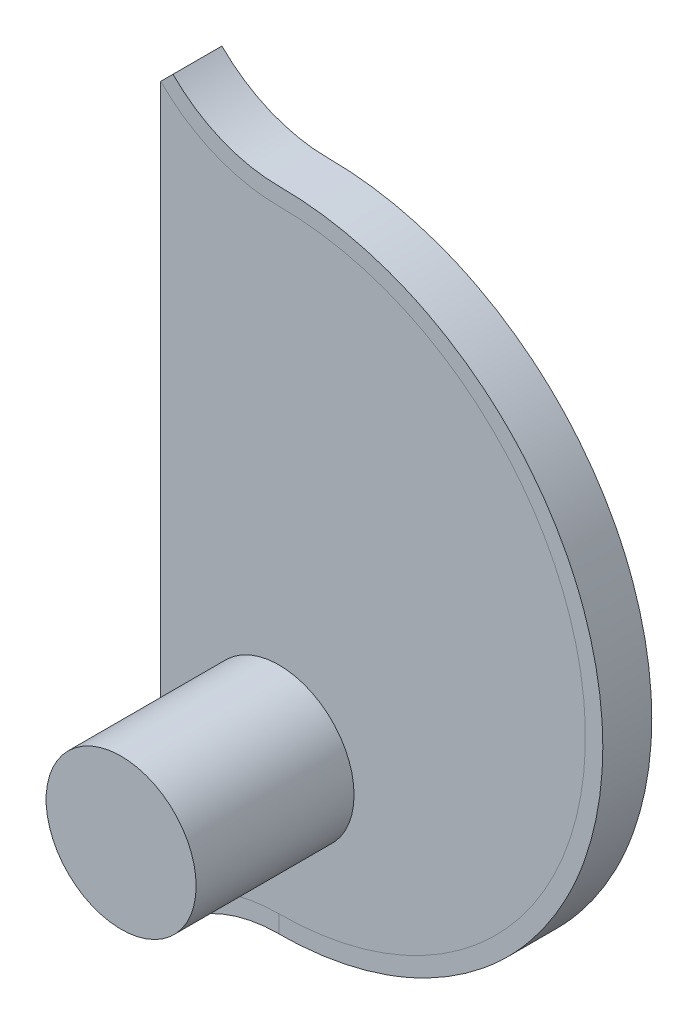
ISO-10303-21;
HEADER;
FILE_DESCRIPTION(('STEP AP214'),'2;1');
FILE_NAME('part.step','',(''),(''),'','','');
FILE_SCHEMA(('AUTOMOTIVE_DESIGN { 1 0 10303 214 1 1 1 1 }'));
ENDSEC;
DATA;
#1=APPLICATION_CONTEXT('core data for automotive mechanical design processes');
#2=APPLICATION_PROTOCOL_DEFINITION('international standard','automotive_design',2000,#1);
#3=PRODUCT_CONTEXT('',#1,'mechanical');
#4=PRODUCT('Part','Part','',(#3));
#5=PRODUCT_RELATED_PRODUCT_CATEGORY('part','',(#4));
#6=PRODUCT_DEFINITION_FORMATION('','',#4);
#7=PRODUCT_DEFINITION_CONTEXT('part definition',#1,'design');
#8=PRODUCT_DEFINITION('design','',#6,#7);
#9=PRODUCT_DEFINITION_SHAPE('','',#8);
#10=(LENGTH_UNIT() NAMED_UNIT(*) SI_UNIT(.MILLI.,.METRE.));
#11=(NAMED_UNIT(*) PLANE_ANGLE_UNIT() SI_UNIT($,.RADIAN.));
#12=(NAMED_UNIT(*) SI_UNIT($,.STERADIAN.) SOLID_ANGLE_UNIT());
#13=UNCERTAINTY_MEASURE_WITH_UNIT(LENGTH_MEASURE(1.E-05),#10,'distance_accuracy_value','');
#14=(GEOMETRIC_REPRESENTATION_CONTEXT(3) GLOBAL_UNCERTAINTY_ASSIGNED_CONTEXT((#13)) GLOBAL_UNIT_ASSIGNED_CONTEXT((#10,
#11,#12)) REPRESENTATION_CONTEXT('',''));
#15=CARTESIAN_POINT('',(0.,0.,0.));
#16=DIRECTION('',(0.,0.,1.));
#17=DIRECTION('',(1.,0.,0.));
#18=AXIS2_PLACEMENT_3D('',#15,#16,#17);
#19=CARTESIAN_POINT('',(-14.9906637611548,0.,-107.965613537095));
#20=DIRECTION('',(-1.,0.,0.));
#21=DIRECTION('',(0.,-1.,0.));
#22=AXIS2_PLACEMENT_3D('',#19,#20,#21);
#23=PLANE('',#22);
#24=DIRECTION('',(0.,1.,0.));
#25=VECTOR('',#24,1.);
#26=CARTESIAN_POINT('',(-14.9906637611548,0.,-3.10000000000001));
#27=LINE('',#26,#25);
#28=CARTESIAN_POINT('',(-14.9906637611548,-86.0093362388452,-3.10000000000001));
#29=VERTEX_POINT('',#28);
#30=CARTESIAN_POINT('',(-14.9906637611548,4.00933623884522,-3.10000000000001));
#31=VERTEX_POINT('',#30);
#32=EDGE_CURVE('E77',#29,#31,#27,.T.);
#33=ORIENTED_EDGE('',*,*,#32,.F.);
#34=DIRECTION('',(0.,0.,1.));
#35=VECTOR('',#34,1.);
#36=CARTESIAN_POINT('',(-14.9906637611548,-86.0093362388452,-107.965613537095));
#37=LINE('',#36,#35);
#38=CARTESIAN_POINT('',(-14.9906637611548,-86.0093362388452,3.1));
#39=VERTEX_POINT('',#38);
#40=EDGE_CURVE('E96',#29,#39,#37,.T.);
#41=ORIENTED_EDGE('',*,*,#40,.T.);
#42=DIRECTION('',(0.,-1.,0.));
#43=VECTOR('',#42,1.);
#44=CARTESIAN_POINT('',(-14.9906637611548,0.,3.1));
#45=LINE('',#44,#43);
#46=CARTESIAN_POINT('',(-14.9906637611548,4.00933623884522,3.1));
#47=VERTEX_POINT('',#46);
#48=EDGE_CURVE('E100',#47,#39,#45,.T.);
#49=ORIENTED_EDGE('',*,*,#48,.F.);
#50=DIRECTION('',(0.,0.,1.));
#51=VECTOR('',#50,1.);
#52=CARTESIAN_POINT('',(-14.9906637611548,4.00933623884522,-107.965613537095));
#53=LINE('',#52,#51);
#54=EDGE_CURVE('E146',#31,#47,#53,.T.);
#55=ORIENTED_EDGE('',*,*,#54,.F.);
#56=EDGE_LOOP('',(#33,#41,#49,#55));
#57=FACE_BOUND('',#56,.T.);
#58=ADVANCED_FACE('F55',(#57),#23,.T.);
#59=CARTESIAN_POINT('',(0.,19.,-107.965613537095));
#60=DIRECTION('',(0.,0.,1.));
#61=DIRECTION('',(1.,0.,0.));
#62=AXIS2_PLACEMENT_3D('',#59,#60,#61);
#63=CYLINDRICAL_SURFACE('',#62,21.2);
#64=DIRECTION('',(0.,0.,1.));
#65=VECTOR('',#64,1.);
#66=CARTESIAN_POINT('',(0.,-2.19999999999999,-107.965613537095));
#67=LINE('',#66,#65);
#68=CARTESIAN_POINT('',(0.,-2.19999999999999,-3.10000000000001));
#69=VERTEX_POINT('',#68);
#70=CARTESIAN_POINT('',(0.,-2.19999999999999,3.1));
#71=VERTEX_POINT('',#70);
#72=EDGE_CURVE('E140',#69,#71,#67,.T.);
#73=ORIENTED_EDGE('',*,*,#72,.F.);
#74=CARTESIAN_POINT('',(0.,19.,-3.10000000000001));
#75=DIRECTION('',(0.,0.,1.));
#76=DIRECTION('',(1.,0.,0.));
#77=AXIS2_PLACEMENT_3D('',#74,#75,#76);
#78=CIRCLE('',#77,21.2);
#79=EDGE_CURVE('E72',#69,#31,#78,.F.);
#80=ORIENTED_EDGE('',*,*,#79,.T.);
#81=ORIENTED_EDGE('',*,*,#54,.T.);
#82=CARTESIAN_POINT('',(0.,19.,3.10000000000001));
#83=DIRECTION('',(0.,0.,1.));
#84=DIRECTION('',(-0.707106781186549,-0.707106781186546,0.));
#85=AXIS2_PLACEMENT_3D('',#82,#83,#84);
#86=CIRCLE('',#85,21.2);
#87=EDGE_CURVE('E105',#47,#71,#86,.T.);
#88=ORIENTED_EDGE('',*,*,#87,.T.);
#89=EDGE_LOOP('',(#73,#80,#81,#88));
#90=FACE_BOUND('',#89,.T.);
#91=ADVANCED_FACE('F157',(#90),#63,.F.);
#92=CARTESIAN_POINT('',(0.,-41.,-107.965613537095));
#93=DIRECTION('',(0.,0.,1.));
#94=DIRECTION('',(1.,0.,0.));
#95=AXIS2_PLACEMENT_3D('',#92,#93,#94);
#96=CYLINDRICAL_SURFACE('',#95,38.8);
#97=DIRECTION('',(0.,0.,1.));
#98=VECTOR('',#97,1.);
#99=CARTESIAN_POINT('',(0.,-79.8,-107.965613537095));
#100=LINE('',#99,#98);
#101=CARTESIAN_POINT('',(0.,-79.8,-3.10000000000001));
#102=VERTEX_POINT('',#101);
#103=CARTESIAN_POINT('',(0.,-79.8,3.1));
#104=VERTEX_POINT('',#103);
#105=EDGE_CURVE('E104',#102,#104,#100,.T.);
#106=ORIENTED_EDGE('',*,*,#105,.F.);
#107=CARTESIAN_POINT('',(0.,-41.,-3.10000000000001));
#108=DIRECTION('',(0.,0.,1.));
#109=DIRECTION('',(1.,0.,0.));
#110=AXIS2_PLACEMENT_3D('',#107,#108,#109);
#111=CIRCLE('',#110,38.8);
#112=EDGE_CURVE('E192',#102,#69,#111,.T.);
#113=ORIENTED_EDGE('',*,*,#112,.T.);
#114=ORIENTED_EDGE('',*,*,#72,.T.);
#115=CARTESIAN_POINT('',(0.,-41.,3.10000000000001));
#116=DIRECTION('',(0.,0.,-1.));
#117=DIRECTION('',(0.,1.,0.));
#118=AXIS2_PLACEMENT_3D('',#115,#116,#117);
#119=CIRCLE('',#118,38.8);
#120=EDGE_CURVE('E115',#71,#104,#119,.T.);
#121=ORIENTED_EDGE('',*,*,#120,.T.);
#122=EDGE_LOOP('',(#106,#113,#114,#121));
#123=FACE_BOUND('',#122,.T.);
#124=ADVANCED_FACE('F166',(#123),#96,.T.);
#125=CARTESIAN_POINT('',(0.,-101.,-107.965613537095));
#126=DIRECTION('',(0.,0.,1.));
#127=DIRECTION('',(1.,0.,0.));
#128=AXIS2_PLACEMENT_3D('',#125,#126,#127);
#129=CYLINDRICAL_SURFACE('',#128,21.2);
#130=CARTESIAN_POINT('',(0.,-101.,-3.10000000000001));
#131=DIRECTION('',(0.,0.,1.));
#132=DIRECTION('',(1.,0.,0.));
#133=AXIS2_PLACEMENT_3D('',#130,#131,#132);
#134=CIRCLE('',#133,21.2);
#135=EDGE_CURVE('E64',#102,#29,#134,.T.);
#136=ORIENTED_EDGE('',*,*,#135,.F.);
#137=ORIENTED_EDGE('',*,*,#105,.T.);
#138=CARTESIAN_POINT('',(0.,-101.,3.1));
#139=DIRECTION('',(0.,0.,1.));
#140=DIRECTION('',(1.,0.,0.));
#141=AXIS2_PLACEMENT_3D('',#138,#139,#140);
#142=CIRCLE('',#141,21.2);
#143=EDGE_CURVE('E108',#39,#104,#142,.F.);
#144=ORIENTED_EDGE('',*,*,#143,.F.);
#145=ORIENTED_EDGE('',*,*,#40,.F.);
#146=EDGE_LOOP('',(#136,#137,#144,#145));
#147=FACE_BOUND('',#146,.T.);
#148=ADVANCED_FACE('F109',(#147),#129,.F.);
#149=CARTESIAN_POINT('',(0.,0.,3.1));
#150=DIRECTION('',(0.,0.,1.));
#151=DIRECTION('',(1.,0.,0.));
#152=AXIS2_PLACEMENT_3D('',#149,#150,#151);
#153=PLANE('',#152);
#154=CARTESIAN_POINT('',(0.,-62.,3.1));
#155=DIRECTION('',(0.,0.,1.));
#156=DIRECTION('',(1.,0.,0.));
#157=AXIS2_PLACEMENT_3D('',#154,#155,#156);
#158=CIRCLE('',#157,9.49999999999999);
#159=CARTESIAN_POINT('',(9.49999999999999,-62.,3.1));
#160=VERTEX_POINT('',#159);
#161=EDGE_CURVE('E12',#160,#160,#158,.T.);
#162=ORIENTED_EDGE('',*,*,#161,.F.);
#163=EDGE_LOOP('',(#162));
#164=FACE_BOUND('',#163,.T.);
#165=ORIENTED_EDGE('',*,*,#48,.T.);
#166=ORIENTED_EDGE('',*,*,#143,.T.);
#167=ORIENTED_EDGE('',*,*,#120,.F.);
#168=ORIENTED_EDGE('',*,*,#87,.F.);
#169=EDGE_LOOP('',(#165,#166,#167,#168));
#170=FACE_BOUND('',#169,.T.);
#171=ADVANCED_FACE('F118',(#164,#170),#153,.T.);
#172=CARTESIAN_POINT('',(0.,-79.8,-3.1));
#173=DIRECTION('',(0.,0.,1.));
#174=DIRECTION('',(1.,0.,0.));
#175=AXIS2_PLACEMENT_3D('',#172,#173,#174);
#176=PLANE('',#175);
#177=CARTESIAN_POINT('',(0.,-62.,-3.1));
#178=DIRECTION('',(0.,0.,1.));
#179=DIRECTION('',(1.,0.,0.));
#180=AXIS2_PLACEMENT_3D('',#177,#178,#179);
#181=CIRCLE('',#180,9.49999999999999);
#182=CARTESIAN_POINT('',(9.49999999999999,-62.,-3.1));
#183=VERTEX_POINT('',#182);
#184=EDGE_CURVE('E58',#183,#183,#181,.T.);
#185=ORIENTED_EDGE('',*,*,#184,.T.);
#186=EDGE_LOOP('',(#185));
#187=FACE_BOUND('',#186,.T.);
#188=ORIENTED_EDGE('',*,*,#32,.T.);
#189=ORIENTED_EDGE('',*,*,#79,.F.);
#190=ORIENTED_EDGE('',*,*,#112,.F.);
#191=ORIENTED_EDGE('',*,*,#135,.T.);
#192=EDGE_LOOP('',(#188,#189,#190,#191));
#193=FACE_BOUND('',#192,.T.);
#194=ADVANCED_FACE('F244',(#187,#193),#176,.F.);
#195=CARTESIAN_POINT('',(0.,-62.,-26.7));
#196=DIRECTION('',(0.,0.,1.));
#197=DIRECTION('',(1.,0.,0.));
#198=AXIS2_PLACEMENT_3D('',#195,#196,#197);
#199=PLANE('',#198);
#200=CARTESIAN_POINT('',(0.,-62.,-26.7));
#201=DIRECTION('',(0.,0.,1.));
#202=DIRECTION('',(1.,0.,0.));
#203=AXIS2_PLACEMENT_3D('',#200,#201,#202);
#204=CIRCLE('',#203,9.49999999999999);
#205=CARTESIAN_POINT('',(9.49999999999999,-62.,-26.7));
#206=VERTEX_POINT('',#205);
#207=EDGE_CURVE('E125',#206,#206,#204,.T.);
#208=ORIENTED_EDGE('',*,*,#207,.F.);
#209=EDGE_LOOP('',(#208));
#210=FACE_BOUND('',#209,.T.);
#211=ADVANCED_FACE('F219',(#210),#199,.F.);
#212=CARTESIAN_POINT('',(0.,-62.,-26.7));
#213=DIRECTION('',(0.,0.,1.));
#214=DIRECTION('',(1.,0.,0.));
#215=AXIS2_PLACEMENT_3D('',#212,#213,#214);
#216=CYLINDRICAL_SURFACE('',#215,9.49999999999999);
#217=ORIENTED_EDGE('',*,*,#207,.T.);
#218=EDGE_LOOP('',(#217));
#219=FACE_BOUND('',#218,.T.);
#220=ORIENTED_EDGE('',*,*,#184,.F.);
#221=EDGE_LOOP('',(#220));
#222=FACE_BOUND('',#221,.T.);
#223=ADVANCED_FACE('F211',(#219,#222),#216,.T.);
#224=ORIENTED_EDGE('',*,*,#161,.T.);
#225=EDGE_LOOP('',(#224));
#226=FACE_BOUND('',#225,.T.);
#227=CARTESIAN_POINT('',(0.,-62.,23.1));
#228=DIRECTION('',(0.,0.,1.));
#229=DIRECTION('',(1.,0.,0.));
#230=AXIS2_PLACEMENT_3D('',#227,#228,#229);
#231=CIRCLE('',#230,9.49999999999999);
#232=CARTESIAN_POINT('',(9.49999999999999,-62.,23.1));
#233=VERTEX_POINT('',#232);
#234=EDGE_CURVE('E202',#233,#233,#231,.T.);
#235=ORIENTED_EDGE('',*,*,#234,.F.);
#236=EDGE_LOOP('',(#235));
#237=FACE_BOUND('',#236,.T.);
#238=ADVANCED_FACE('F209',(#226,#237),#216,.T.);
#239=CARTESIAN_POINT('',(0.,-62.,23.1));
#240=DIRECTION('',(0.,0.,1.));
#241=DIRECTION('',(1.,0.,0.));
#242=AXIS2_PLACEMENT_3D('',#239,#240,#241);
#243=PLANE('',#242);
#244=ORIENTED_EDGE('',*,*,#234,.T.);
#245=EDGE_LOOP('',(#244));
#246=FACE_BOUND('',#245,.T.);
#247=ADVANCED_FACE('F207',(#246),#243,.T.);
#248=CLOSED_SHELL('',(#58,#91,#124,#148,#171,#194,#211,#223,#238,#247));
#249=MANIFOLD_SOLID_BREP('B2',#248);
#250=CARTESIAN_POINT('',(-13.4350288425444,-87.5649711574556,0.));
#251=DIRECTION('',(0.707106781186546,0.707106781186549,0.));
#252=DIRECTION('',(0.,0.,1.));
#253=AXIS2_PLACEMENT_3D('',#250,#251,#252);
#254=PLANE('',#253);
#255=DIRECTION('',(0.707106781186549,-0.707106781186546,0.));
#256=VECTOR('',#255,1.);
#257=CARTESIAN_POINT('',(-14.9906637611548,-86.0093362388452,-3.1));
#258=LINE('',#257,#256);
#259=CARTESIAN_POINT('',(-14.9906637611548,-86.0093362388452,-3.1));
#260=VERTEX_POINT('',#259);
#261=CARTESIAN_POINT('',(-13.4350288425444,-87.5649711574556,-3.1));
#262=VERTEX_POINT('',#261);
#263=EDGE_CURVE('E422',#260,#262,#258,.T.);
#264=ORIENTED_EDGE('',*,*,#263,.T.);
#265=DIRECTION('',(0.,0.,1.));
#266=VECTOR('',#265,1.);
#267=CARTESIAN_POINT('',(-13.4350288425444,-87.5649711574556,3.1));
#268=LINE('',#267,#266);
#269=CARTESIAN_POINT('',(-13.4350288425444,-87.5649711574556,3.1));
#270=VERTEX_POINT('',#269);
#271=EDGE_CURVE('E429',#262,#270,#268,.T.);
#272=ORIENTED_EDGE('',*,*,#271,.T.);
#273=DIRECTION('',(-0.707106781186549,0.707106781186546,0.));
#274=VECTOR('',#273,1.);
#275=CARTESIAN_POINT('',(-13.4350288425444,-87.5649711574556,3.1));
#276=LINE('',#275,#274);
#277=CARTESIAN_POINT('',(-14.9906637611548,-86.0093362388452,3.1));
#278=VERTEX_POINT('',#277);
#279=EDGE_CURVE('E411',#270,#278,#276,.T.);
#280=ORIENTED_EDGE('',*,*,#279,.T.);
#281=DIRECTION('',(0.,0.,-1.));
#282=VECTOR('',#281,1.);
#283=CARTESIAN_POINT('',(-14.9906637611548,-86.0093362388452,3.1));
#284=LINE('',#283,#282);
#285=EDGE_CURVE('E404',#278,#260,#284,.T.);
#286=ORIENTED_EDGE('',*,*,#285,.T.);
#287=EDGE_LOOP('',(#264,#272,#280,#286));
#288=FACE_BOUND('',#287,.T.);
#289=ADVANCED_FACE('F328',(#288),#254,.F.);
#290=CARTESIAN_POINT('',(-13.4350288425444,5.56497115745562,0.));
#291=DIRECTION('',(-0.707106781186547,0.707106781186549,0.));
#292=DIRECTION('',(0.,0.,1.));
#293=AXIS2_PLACEMENT_3D('',#290,#291,#292);
#294=PLANE('',#293);
#295=DIRECTION('',(0.707106781186549,0.707106781186546,0.));
#296=VECTOR('',#295,1.);
#297=CARTESIAN_POINT('',(-14.9906637611548,4.00933623884522,-3.1));
#298=LINE('',#297,#296);
#299=CARTESIAN_POINT('',(-14.9906637611548,4.00933623884522,-3.1));
#300=VERTEX_POINT('',#299);
#301=CARTESIAN_POINT('',(-13.4350288425444,5.56497115745562,-3.1));
#302=VERTEX_POINT('',#301);
#303=EDGE_CURVE('E360',#300,#302,#298,.T.);
#304=ORIENTED_EDGE('',*,*,#303,.F.);
#305=DIRECTION('',(0.,0.,-1.));
#306=VECTOR('',#305,1.);
#307=CARTESIAN_POINT('',(-14.9906637611548,4.00933623884522,3.1));
#308=LINE('',#307,#306);
#309=CARTESIAN_POINT('',(-14.9906637611548,4.00933623884521,3.1));
#310=VERTEX_POINT('',#309);
#311=EDGE_CURVE('E53',#310,#300,#308,.T.);
#312=ORIENTED_EDGE('',*,*,#311,.F.);
#313=DIRECTION('',(-0.707106781186549,-0.707106781186546,0.));
#314=VECTOR('',#313,1.);
#315=CARTESIAN_POINT('',(-13.4350288425444,5.56497115745562,3.1));
#316=LINE('',#315,#314);
#317=CARTESIAN_POINT('',(-13.4350288425444,5.56497115745562,3.1));
#318=VERTEX_POINT('',#317);
#319=EDGE_CURVE('E347',#318,#310,#316,.T.);
#320=ORIENTED_EDGE('',*,*,#319,.F.);
#321=DIRECTION('',(0.,0.,1.));
#322=VECTOR('',#321,1.);
#323=CARTESIAN_POINT('',(-13.4350288425444,5.56497115745562,3.1));
#324=LINE('',#323,#322);
#325=EDGE_CURVE('E604',#302,#318,#324,.T.);
#326=ORIENTED_EDGE('',*,*,#325,.F.);
#327=EDGE_LOOP('',(#304,#312,#320,#326));
#328=FACE_BOUND('',#327,.T.);
#329=ADVANCED_FACE('F571',(#328),#294,.T.);
#330=CARTESIAN_POINT('',(-14.9906637611548,-86.0093362388452,-3.1));
#331=DIRECTION('',(0.,0.,1.));
#332=DIRECTION('',(1.,0.,0.));
#333=AXIS2_PLACEMENT_3D('',#330,#331,#332);
#334=PLANE('',#333);
#335=CARTESIAN_POINT('',(0.,-101.,-3.1));
#336=DIRECTION('',(0.,0.,-1.));
#337=DIRECTION('',(-0.707106781186549,0.707106781186546,0.));
#338=AXIS2_PLACEMENT_3D('',#335,#336,#337);
#339=CIRCLE('',#338,19.);
#340=CARTESIAN_POINT('',(0.,-82.,-3.1));
#341=VERTEX_POINT('',#340);
#342=EDGE_CURVE('E427',#262,#341,#339,.T.);
#343=ORIENTED_EDGE('',*,*,#342,.F.);
#344=ORIENTED_EDGE('',*,*,#263,.F.);
#345=CARTESIAN_POINT('',(0.,-101.,-3.1));
#346=DIRECTION('',(0.,0.,-1.));
#347=DIRECTION('',(-0.707106781186549,0.707106781186546,0.));
#348=AXIS2_PLACEMENT_3D('',#345,#346,#347);
#349=CIRCLE('',#348,21.2);
#350=CARTESIAN_POINT('',(0.,-79.8,-3.1));
#351=VERTEX_POINT('',#350);
#352=EDGE_CURVE('E425',#260,#351,#349,.T.);
#353=ORIENTED_EDGE('',*,*,#352,.T.);
#354=DIRECTION('',(0.,-1.,0.));
#355=VECTOR('',#354,1.);
#356=CARTESIAN_POINT('',(0.,-79.8,-3.1));
#357=LINE('',#356,#355);
#358=EDGE_CURVE('E434',#351,#341,#357,.T.);
#359=ORIENTED_EDGE('',*,*,#358,.T.);
#360=EDGE_LOOP('',(#343,#344,#353,#359));
#361=FACE_BOUND('',#360,.T.);
#362=ADVANCED_FACE('F423',(#361),#334,.F.);
#363=CARTESIAN_POINT('',(0.,-101.,0.));
#364=DIRECTION('',(0.,0.,-1.));
#365=DIRECTION('',(-1.,0.,0.));
#366=AXIS2_PLACEMENT_3D('',#363,#364,#365);
#367=CYLINDRICAL_SURFACE('',#366,19.);
#368=CARTESIAN_POINT('',(0.,-101.,3.1));
#369=DIRECTION('',(0.,0.,-1.));
#370=DIRECTION('',(-0.707106781186549,0.707106781186546,0.));
#371=AXIS2_PLACEMENT_3D('',#368,#369,#370);
#372=CIRCLE('',#371,19.);
#373=CARTESIAN_POINT('',(0.,-82.,3.1));
#374=VERTEX_POINT('',#373);
#375=EDGE_CURVE('E500',#270,#374,#372,.T.);
#376=ORIENTED_EDGE('',*,*,#375,.F.);
#377=ORIENTED_EDGE('',*,*,#271,.F.);
#378=ORIENTED_EDGE('',*,*,#342,.T.);
#379=DIRECTION('',(0.,0.,1.));
#380=VECTOR('',#379,1.);
#381=CARTESIAN_POINT('',(0.,-82.,3.1));
#382=LINE('',#381,#380);
#383=EDGE_CURVE('E503',#341,#374,#382,.T.);
#384=ORIENTED_EDGE('',*,*,#383,.T.);
#385=EDGE_LOOP('',(#376,#377,#378,#384));
#386=FACE_BOUND('',#385,.T.);
#387=ADVANCED_FACE('F532',(#386),#367,.F.);
#388=CARTESIAN_POINT('',(-13.4350288425444,-87.5649711574556,3.1));
#389=DIRECTION('',(0.,0.,-1.));
#390=DIRECTION('',(-1.,0.,0.));
#391=AXIS2_PLACEMENT_3D('',#388,#389,#390);
#392=PLANE('',#391);
#393=CARTESIAN_POINT('',(0.,-101.,3.1));
#394=DIRECTION('',(0.,0.,-1.));
#395=DIRECTION('',(-0.707106781186549,0.707106781186546,0.));
#396=AXIS2_PLACEMENT_3D('',#393,#394,#395);
#397=CIRCLE('',#396,21.2);
#398=CARTESIAN_POINT('',(0.,-79.8,3.1));
#399=VERTEX_POINT('',#398);
#400=EDGE_CURVE('E557',#278,#399,#397,.T.);
#401=ORIENTED_EDGE('',*,*,#400,.F.);
#402=ORIENTED_EDGE('',*,*,#279,.F.);
#403=ORIENTED_EDGE('',*,*,#375,.T.);
#404=DIRECTION('',(0.,1.,0.));
#405=VECTOR('',#404,1.);
#406=CARTESIAN_POINT('',(0.,-82.,3.1));
#407=LINE('',#406,#405);
#408=EDGE_CURVE('E502',#374,#399,#407,.T.);
#409=ORIENTED_EDGE('',*,*,#408,.T.);
#410=EDGE_LOOP('',(#401,#402,#403,#409));
#411=FACE_BOUND('',#410,.T.);
#412=ADVANCED_FACE('F468',(#411),#392,.F.);
#413=CARTESIAN_POINT('',(0.,-101.,0.));
#414=DIRECTION('',(0.,0.,-1.));
#415=DIRECTION('',(-1.,0.,0.));
#416=AXIS2_PLACEMENT_3D('',#413,#414,#415);
#417=CYLINDRICAL_SURFACE('',#416,21.2);
#418=DIRECTION('',(0.,0.,-1.));
#419=VECTOR('',#418,1.);
#420=CARTESIAN_POINT('',(0.,-79.8,3.1));
#421=LINE('',#420,#419);
#422=EDGE_CURVE('E433',#399,#351,#421,.T.);
#423=ORIENTED_EDGE('',*,*,#422,.T.);
#424=ORIENTED_EDGE('',*,*,#352,.F.);
#425=ORIENTED_EDGE('',*,*,#285,.F.);
#426=ORIENTED_EDGE('',*,*,#400,.T.);
#427=EDGE_LOOP('',(#423,#424,#425,#426));
#428=FACE_BOUND('',#427,.T.);
#429=ADVANCED_FACE('F432',(#428),#417,.T.);
#430=CARTESIAN_POINT('',(0.,-79.8,-3.1));
#431=DIRECTION('',(0.,0.,1.));
#432=DIRECTION('',(1.,0.,0.));
#433=AXIS2_PLACEMENT_3D('',#430,#431,#432);
#434=PLANE('',#433);
#435=CARTESIAN_POINT('',(0.,19.,-3.1));
#436=DIRECTION('',(0.,0.,-1.));
#437=DIRECTION('',(0.,-1.,0.));
#438=AXIS2_PLACEMENT_3D('',#435,#436,#437);
#439=CIRCLE('',#438,19.);
#440=CARTESIAN_POINT('',(0.,0.,-3.1));
#441=VERTEX_POINT('',#440);
#442=EDGE_CURVE('E606',#441,#302,#439,.T.);
#443=ORIENTED_EDGE('',*,*,#442,.F.);
#444=CARTESIAN_POINT('',(0.,-41.,-3.1));
#445=DIRECTION('',(0.,0.,1.));
#446=DIRECTION('',(0.,-1.,0.));
#447=AXIS2_PLACEMENT_3D('',#444,#445,#446);
#448=CIRCLE('',#447,41.);
#449=EDGE_CURVE('E389',#341,#441,#448,.T.);
#450=ORIENTED_EDGE('',*,*,#449,.F.);
#451=ORIENTED_EDGE('',*,*,#358,.F.);
#452=CARTESIAN_POINT('',(0.,-41.,-3.1));
#453=DIRECTION('',(0.,0.,1.));
#454=DIRECTION('',(0.,-1.,0.));
#455=AXIS2_PLACEMENT_3D('',#452,#453,#454);
#456=CIRCLE('',#455,38.8);
#457=CARTESIAN_POINT('',(0.,-2.2,-3.1));
#458=VERTEX_POINT('',#457);
#459=EDGE_CURVE('E395',#351,#458,#456,.T.);
#460=ORIENTED_EDGE('',*,*,#459,.T.);
#461=CARTESIAN_POINT('',(0.,19.,-3.1));
#462=DIRECTION('',(0.,0.,-1.));
#463=DIRECTION('',(0.,-1.,0.));
#464=AXIS2_PLACEMENT_3D('',#461,#462,#463);
#465=CIRCLE('',#464,21.2);
#466=EDGE_CURVE('E331',#458,#300,#465,.T.);
#467=ORIENTED_EDGE('',*,*,#466,.T.);
#468=ORIENTED_EDGE('',*,*,#303,.T.);
#469=EDGE_LOOP('',(#443,#450,#451,#460,#467,#468));
#470=FACE_BOUND('',#469,.T.);
#471=ADVANCED_FACE('F522',(#470),#434,.F.);
#472=CARTESIAN_POINT('',(0.,-82.,-3.1));
#473=CARTESIAN_POINT('',(5.36776501951954,-82.,-3.1));
#474=CARTESIAN_POINT('',(10.7316633803993,-80.9328796930245,-3.1));
#475=CARTESIAN_POINT('',(20.648378073538,-76.825241972901,-3.1));
#476=CARTESIAN_POINT('',(25.1964156120921,-73.7863404452141,-3.1));
#477=CARTESIAN_POINT('',(32.7863404452048,-66.1964156120828,-3.1));
#478=CARTESIAN_POINT('',(35.8252419729196,-61.6483780735381,-3.1));
#479=CARTESIAN_POINT('',(39.9328796930059,-51.7316633803994,-3.1));
#480=CARTESIAN_POINT('',(41.,-46.3668873182825,-3.1));
#481=CARTESIAN_POINT('',(41.,-35.6331126817174,-3.1));
#482=CARTESIAN_POINT('',(39.9328796930251,-30.2683366196501,-3.1));
#483=CARTESIAN_POINT('',(35.8252419729004,-20.3516219264125,-3.1));
#484=CARTESIAN_POINT('',(32.7863404452366,-15.8035843879396,-3.1));
#485=CARTESIAN_POINT('',(25.1964156120604,-8.21365955476345,-3.1));
#486=CARTESIAN_POINT('',(20.6483780735967,-5.17475802709953,-3.1));
#487=CARTESIAN_POINT('',(13.2108420536546,-2.09402973700606,-3.1));
#488=CARTESIAN_POINT('',(10.6307153540739,-1.31134327147106,-3.1));
#489=CARTESIAN_POINT('',(6.68269712695501,-0.526033619465815,-3.1));
#490=CARTESIAN_POINT('',(5.35384056760659,-0.328922129097256,-3.1));
#491=CARTESIAN_POINT('',(3.35096703725398,-0.131661816067534,-3.1));
#492=CARTESIAN_POINT('',(2.68174444060555,-0.082298868026777,-3.1));
#493=CARTESIAN_POINT('',(1.67670442420258,-0.0329258175993421,-3.1));
#494=CARTESIAN_POINT('',(1.3414898180801,-0.0205794170145951,-3.1));
#495=CARTESIAN_POINT('',(0.838512077002908,-0.00823224037489775,-3.1));
#496=CARTESIAN_POINT('',(0.670826835279558,-0.00514521774556921,-3.1));
#497=CARTESIAN_POINT('',(0.335428412956457,-0.0010290977835452,-3.1));
#498=CARTESIAN_POINT('',(0.167715226293361,-3.22943280531524E-06,-3.1));
#499=CARTESIAN_POINT('',(-0.15544338046702,2.99313284395076E-06,-3.1));
#500=CARTESIAN_POINT('',(-0.310883018823807,0.00190765321474462,-3.1));
#501=CARTESIAN_POINT('',(-0.621666013202664,0.00953680300514296,-3.1));
#502=CARTESIAN_POINT('',(-0.777009367370069,0.0152583057189287,-3.1));
#503=CARTESIAN_POINT('',(-1.24275961870406,0.0381384998129758,-3.1));
#504=CARTESIAN_POINT('',(-1.55288716371663,0.0610140123347576,-3.1));
#505=CARTESIAN_POINT('',(-2.4810480676928,0.152427328096663,-3.1));
#506=CARTESIAN_POINT('',(-3.09685964442044,0.243771677355488,-3.1));
#507=CARTESIAN_POINT('',(-4.92642906607849,0.607695662304895,-3.1));
#508=CARTESIAN_POINT('',(-6.12209758279075,0.970404043408716,-3.1));
#509=CARTESIAN_POINT('',(-9.56876047922876,2.39805856003928,-3.1));
#510=CARTESIAN_POINT('',(-11.6757911148967,3.80573342984025,-3.1));
#511=CARTESIAN_POINT('',(-13.4350288425444,5.56497115745562,-3.1));
#512=CARTESIAN_POINT('',(0.,-82.,3.1));
#513=CARTESIAN_POINT('',(5.36776501951954,-82.,3.1));
#514=CARTESIAN_POINT('',(10.7316633803993,-80.9328796930245,3.1));
#515=CARTESIAN_POINT('',(20.648378073538,-76.825241972901,3.1));
#516=CARTESIAN_POINT('',(25.1964156120921,-73.7863404452141,3.1));
#517=CARTESIAN_POINT('',(32.7863404452048,-66.1964156120828,3.1));
#518=CARTESIAN_POINT('',(35.8252419729196,-61.6483780735381,3.1));
#519=CARTESIAN_POINT('',(39.9328796930059,-51.7316633803994,3.1));
#520=CARTESIAN_POINT('',(41.,-46.3668873182825,3.1));
#521=CARTESIAN_POINT('',(41.,-35.6331126817174,3.1));
#522=CARTESIAN_POINT('',(39.9328796930251,-30.2683366196501,3.1));
#523=CARTESIAN_POINT('',(35.8252419729004,-20.3516219264125,3.1));
#524=CARTESIAN_POINT('',(32.7863404452366,-15.8035843879396,3.1));
#525=CARTESIAN_POINT('',(25.1964156120604,-8.21365955476345,3.1));
#526=CARTESIAN_POINT('',(20.6483780735967,-5.17475802709953,3.1));
#527=CARTESIAN_POINT('',(13.2108420536546,-2.09402973700606,3.1));
#528=CARTESIAN_POINT('',(10.6307153540739,-1.31134327147106,3.1));
#529=CARTESIAN_POINT('',(6.68269712695501,-0.526033619465815,3.1));
#530=CARTESIAN_POINT('',(5.35384056760659,-0.328922129097256,3.1));
#531=CARTESIAN_POINT('',(3.35096703725398,-0.131661816067534,3.1));
#532=CARTESIAN_POINT('',(2.68174444060555,-0.082298868026777,3.1));
#533=CARTESIAN_POINT('',(1.67670442420258,-0.0329258175993421,3.1));
#534=CARTESIAN_POINT('',(1.3414898180801,-0.0205794170145951,3.1));
#535=CARTESIAN_POINT('',(0.838512077002908,-0.00823224037489775,3.1));
#536=CARTESIAN_POINT('',(0.670826835279558,-0.00514521774556921,3.1));
#537=CARTESIAN_POINT('',(0.335428412956457,-0.0010290977835452,3.1));
#538=CARTESIAN_POINT('',(0.167715226293361,-3.22943280531524E-06,3.1));
#539=CARTESIAN_POINT('',(-0.15544338046702,2.99313284395076E-06,3.1));
#540=CARTESIAN_POINT('',(-0.310883018823807,0.00190765321474462,3.1));
#541=CARTESIAN_POINT('',(-0.621666013202664,0.00953680300514296,3.1));
#542=CARTESIAN_POINT('',(-0.777009367370069,0.0152583057189287,3.1));
#543=CARTESIAN_POINT('',(-1.24275961870406,0.0381384998129758,3.1));
#544=CARTESIAN_POINT('',(-1.55288716371663,0.0610140123347576,3.1));
#545=CARTESIAN_POINT('',(-2.4810480676928,0.152427328096663,3.1));
#546=CARTESIAN_POINT('',(-3.09685964442044,0.243771677355488,3.1));
#547=CARTESIAN_POINT('',(-4.92642906607849,0.607695662304895,3.1));
#548=CARTESIAN_POINT('',(-6.12209758279075,0.970404043408716,3.1));
#549=CARTESIAN_POINT('',(-9.56876047922876,2.39805856003928,3.1));
#550=CARTESIAN_POINT('',(-11.6757911148967,3.80573342984025,3.1));
#551=CARTESIAN_POINT('',(-13.4350288425444,5.56497115745562,3.1));
#552=B_SPLINE_SURFACE_WITH_KNOTS('',1,3,((#472,#473,#474,#475,#476,#477,#478,#479,#480,#481,
#482,#483,#484,#485,#486,#487,#488,#489,#490,#491,#492,#493,#494,#495,#496,#497,#498,#499,#500,
#501,#502,#503,#504,#505,#506,#507,#508,#509,#510,#511),(#512,#513,#514,#515,#516,#517,#518,
#519,#520,#521,#522,#523,#524,#525,#526,#527,#528,#529,#530,#531,#532,#533,#534,#535,#536,#537,
#538,#539,#540,#541,#542,#543,#544,#545,#546,#547,#548,#549,#550,#551)),.UNSPECIFIED.,.F.,.F.,
.F.,(2,2),(4,2,2,2,2,2,2,2,2,2,2,2,2,2,2,2,2,2,2,4),(0.,1.),(0.0940594059405942,
0.195544554455446,0.297029702970297,0.398514851485149,0.5,0.601485148514851,0.702970297029703,
0.804455445544554,0.85519801980198,0.880569306930693,0.893254950495049,0.899597772277227,
0.902769183168317,0.905940594059406,0.908879950495049,0.911819306930693,0.91769801980198,
0.929455445544554,0.952970297029703,1.),.UNSPECIFIED.);
#553=CARTESIAN_POINT('',(0.,19.,3.1));
#554=DIRECTION('',(0.,0.,-1.));
#555=DIRECTION('',(0.,-1.,0.));
#556=AXIS2_PLACEMENT_3D('',#553,#554,#555);
#557=CIRCLE('',#556,19.);
#558=CARTESIAN_POINT('',(0.,0.,3.1));
#559=VERTEX_POINT('',#558);
#560=EDGE_CURVE('E445',#559,#318,#557,.T.);
#561=CARTESIAN_POINT('',(0.,-41.,3.1));
#562=DIRECTION('',(0.,0.,1.));
#563=DIRECTION('',(0.,-1.,0.));
#564=AXIS2_PLACEMENT_3D('',#561,#562,#563);
#565=CIRCLE('',#564,41.);
#566=EDGE_CURVE('E494',#374,#559,#565,.T.);
#567=ORIENTED_EDGE('',*,*,#560,.F.);
#568=ORIENTED_EDGE('',*,*,#566,.F.);
#569=ORIENTED_EDGE('',*,*,#383,.F.);
#570=ORIENTED_EDGE('',*,*,#449,.T.);
#571=ORIENTED_EDGE('',*,*,#442,.T.);
#572=ORIENTED_EDGE('',*,*,#325,.T.);
#573=EDGE_LOOP('',(#567,#568,#569,#570,#571,#572));
#574=FACE_BOUND('',#573,.T.);
#575=ADVANCED_FACE('F467',(#574),#552,.F.);
#576=CARTESIAN_POINT('',(0.,-82.,3.1));
#577=DIRECTION('',(0.,0.,-1.));
#578=DIRECTION('',(-1.,0.,0.));
#579=AXIS2_PLACEMENT_3D('',#576,#577,#578);
#580=PLANE('',#579);
#581=CARTESIAN_POINT('',(0.,19.,3.1));
#582=DIRECTION('',(0.,0.,-1.));
#583=DIRECTION('',(0.,-1.,0.));
#584=AXIS2_PLACEMENT_3D('',#581,#582,#583);
#585=CIRCLE('',#584,21.2);
#586=CARTESIAN_POINT('',(0.,-2.2,3.1));
#587=VERTEX_POINT('',#586);
#588=EDGE_CURVE('E338',#587,#310,#585,.T.);
#589=ORIENTED_EDGE('',*,*,#588,.F.);
#590=CARTESIAN_POINT('',(0.,-41.,3.1));
#591=DIRECTION('',(0.,0.,1.));
#592=DIRECTION('',(0.,-1.,0.));
#593=AXIS2_PLACEMENT_3D('',#590,#591,#592);
#594=CIRCLE('',#593,38.8);
#595=EDGE_CURVE('E497',#399,#587,#594,.T.);
#596=ORIENTED_EDGE('',*,*,#595,.F.);
#597=ORIENTED_EDGE('',*,*,#408,.F.);
#598=ORIENTED_EDGE('',*,*,#566,.T.);
#599=ORIENTED_EDGE('',*,*,#560,.T.);
#600=ORIENTED_EDGE('',*,*,#319,.T.);
#601=EDGE_LOOP('',(#589,#596,#597,#598,#599,#600));
#602=FACE_BOUND('',#601,.T.);
#603=ADVANCED_FACE('F456',(#602),#580,.F.);
#604=CARTESIAN_POINT('',(0.,-79.8,3.1));
#605=CARTESIAN_POINT('',(5.07973860383852,-79.8,3.1));
#606=CARTESIAN_POINT('',(10.1558180282797,-78.7901398070903,3.1));
#607=CARTESIAN_POINT('',(19.5404163232513,-74.9029119157856,3.1));
#608=CARTESIAN_POINT('',(23.84441282315,-72.0270733969261,3.1));
#609=CARTESIAN_POINT('',(31.0270733969262,-64.8444128231499,3.1));
#610=CARTESIAN_POINT('',(33.9029119158415,-60.5404163232606,3.1));
#611=CARTESIAN_POINT('',(37.7901398070344,-51.1558180282704,3.1));
#612=CARTESIAN_POINT('',(38.8,-46.0789079987567,3.1));
#613=CARTESIAN_POINT('',(38.8,-35.9210920012432,3.1));
#614=CARTESIAN_POINT('',(37.7901398070545,-30.8441819717721,3.1));
#615=CARTESIAN_POINT('',(33.9029119158213,-21.4595836766969,3.1));
#616=CARTESIAN_POINT('',(31.0270733969504,-17.1555871768836,3.1));
#617=CARTESIAN_POINT('',(23.8444128231257,-9.9729266030403,3.1));
#618=CARTESIAN_POINT('',(19.5404163233077,-7.09708808418097,3.1));
#619=CARTESIAN_POINT('',(12.5019676019943,-4.18166716575259,3.1));
#620=CARTESIAN_POINT('',(10.0602867253185,-3.44097851056196,3.1));
#621=CARTESIAN_POINT('',(6.32411337867948,-2.69780742525102,3.1));
#622=CARTESIAN_POINT('',(5.0665613176374,-2.51127264899939,3.1));
#623=CARTESIAN_POINT('',(3.17115904988916,-2.32459703569316,3.1));
#624=CARTESIAN_POINT('',(2.53784595842675,-2.2778828312057,3.1));
#625=CARTESIAN_POINT('',(1.58673491851365,-2.23115906641115,3.1));
#626=CARTESIAN_POINT('',(1.26950743759776,-2.21947515561393,3.1));
#627=CARTESIAN_POINT('',(0.793518746041774,-2.2077905104035,3.1));
#628=CARTESIAN_POINT('',(0.634831248996263,-2.20486913289091,3.1));
#629=CARTESIAN_POINT('',(0.317429815188064,-2.20097387790249,3.1));
#630=CARTESIAN_POINT('',(0.172925378177511,-2.20000343008054,3.1));
#631=CARTESIAN_POINT('',(-0.160272301725501,-2.19999682090096,3.1));
#632=CARTESIAN_POINT('',(-0.346879999950775,-2.19787146062351,3.1));
#633=CARTESIAN_POINT('',(-0.69364839367876,-2.1893589355943,3.1));
#634=CARTESIAN_POINT('',(-0.866978873065555,-2.18297494309252,3.1));
#635=CARTESIAN_POINT('',(-1.38665810086978,-2.15744546336665,3.1));
#636=CARTESIAN_POINT('',(-1.73269515109433,-2.13192120728964,3.1));
#637=CARTESIAN_POINT('',(-2.7683273176362,-2.02992319180794,3.1));
#638=CARTESIAN_POINT('',(-3.45544339272179,-1.92800212842431,3.1));
#639=CARTESIAN_POINT('',(-5.49685769478223,-1.52193957679682,3.1));
#640=CARTESIAN_POINT('',(-6.83097203974486,-1.11723338314363,3.1));
#641=CARTESIAN_POINT('',(-10.6767222189302,0.475728498569492,3.1));
#642=CARTESIAN_POINT('',(-13.0277248229369,2.04639730066392,3.1));
#643=CARTESIAN_POINT('',(-14.9906637611548,4.00933623884522,3.1));
#644=CARTESIAN_POINT('',(0.,-79.8,-3.1));
#645=CARTESIAN_POINT('',(5.07973860383852,-79.8,-3.1));
#646=CARTESIAN_POINT('',(10.1558180282797,-78.790139807053,-3.1));
#647=CARTESIAN_POINT('',(19.5404163232513,-74.9029119158228,-3.1));
#648=CARTESIAN_POINT('',(23.84441282315,-72.0270733969261,-3.1));
#649=CARTESIAN_POINT('',(31.0270733969262,-64.8444128231499,-3.1));
#650=CARTESIAN_POINT('',(33.9029119158228,-60.5404163232606,-3.1));
#651=CARTESIAN_POINT('',(37.790139807053,-51.1558180282704,-3.1));
#652=CARTESIAN_POINT('',(38.8,-46.0789079987567,-3.1));
#653=CARTESIAN_POINT('',(38.8,-35.9210920012432,-3.1));
#654=CARTESIAN_POINT('',(37.7901398070545,-30.8441819717628,-3.1));
#655=CARTESIAN_POINT('',(33.9029119158213,-21.4595836767062,-3.1));
#656=CARTESIAN_POINT('',(31.0270733969597,-17.1555871768789,-3.1));
#657=CARTESIAN_POINT('',(23.8444128231164,-9.97292660304496,-3.1));
#658=CARTESIAN_POINT('',(19.5404163233077,-7.09708808417864,-3.1));
#659=CARTESIAN_POINT('',(12.5019676019943,-4.18166716575376,-3.1));
#660=CARTESIAN_POINT('',(10.0602867253197,-3.44097851056254,-3.1));
#661=CARTESIAN_POINT('',(6.3241133786789,-2.69780742525073,-3.1));
#662=CARTESIAN_POINT('',(5.0665613176374,-2.51127264899938,-3.1));
#663=CARTESIAN_POINT('',(3.17115904988916,-2.32459703569316,-3.1));
#664=CARTESIAN_POINT('',(2.53784595842667,-2.2778828312057,-3.1));
#665=CARTESIAN_POINT('',(1.58673491851369,-2.23115906641115,-3.1));
#666=CARTESIAN_POINT('',(1.26950743759776,-2.21947515561393,-3.1));
#667=CARTESIAN_POINT('',(0.793518746041774,-2.2077905104035,-3.1));
#668=CARTESIAN_POINT('',(0.634831248996263,-2.20486913289091,-3.1));
#669=CARTESIAN_POINT('',(0.317429815188064,-2.20097387790249,-3.1));
#670=CARTESIAN_POINT('',(0.172925378177511,-2.20000343008054,-3.1));
#671=CARTESIAN_POINT('',(-0.160272301725501,-2.19999682090096,-3.1));
#672=CARTESIAN_POINT('',(-0.346879999950767,-2.19787146062351,-3.1));
#673=CARTESIAN_POINT('',(-0.693648393678768,-2.1893589355943,-3.1));
#674=CARTESIAN_POINT('',(-0.866978873065555,-2.18297494309252,-3.1));
#675=CARTESIAN_POINT('',(-1.38665810086978,-2.15744546336665,-3.1));
#676=CARTESIAN_POINT('',(-1.7326951510944,-2.13192120728964,-3.1));
#677=CARTESIAN_POINT('',(-2.76832731763607,-2.02992319180794,-3.1));
#678=CARTESIAN_POINT('',(-3.45544339272152,-1.92800212842431,-3.1));
#679=CARTESIAN_POINT('',(-5.49685769478277,-1.52193957679682,-3.1));
#680=CARTESIAN_POINT('',(-6.83097203974594,-1.11723338314363,-3.1));
#681=CARTESIAN_POINT('',(-10.676722218928,0.475728498569492,-3.1));
#682=CARTESIAN_POINT('',(-13.0277248229387,2.04639730066365,-3.1));
#683=CARTESIAN_POINT('',(-14.9906637611548,4.00933623884522,-3.1));
#684=B_SPLINE_SURFACE_WITH_KNOTS('',1,3,((#604,#605,#606,#607,#608,#609,#610,#611,#612,#613,
#614,#615,#616,#617,#618,#619,#620,#621,#622,#623,#624,#625,#626,#627,#628,#629,#630,#631,#632,
#633,#634,#635,#636,#637,#638,#639,#640,#641,#642,#643),(#644,#645,#646,#647,#648,#649,#650,
#651,#652,#653,#654,#655,#656,#657,#658,#659,#660,#661,#662,#663,#664,#665,#666,#667,#668,#669,
#670,#671,#672,#673,#674,#675,#676,#677,#678,#679,#680,#681,#682,#683)),.UNSPECIFIED.,.F.,.F.,
.F.,(2,2),(4,2,2,2,2,2,2,2,2,2,2,2,2,2,2,2,2,2,2,4),(0.,1.),(0.0940594059405942,
0.195544554455446,0.297029702970297,0.398514851485149,0.5,0.601485148514851,0.702970297029703,
0.804455445544554,0.85519801980198,0.880569306930693,0.893254950495049,0.899597772277227,
0.902769183168317,0.905940594059406,0.908879950495049,0.911819306930693,0.91769801980198,
0.929455445544554,0.952970297029703,1.),.UNSPECIFIED.);
#685=ORIENTED_EDGE('',*,*,#311,.T.);
#686=ORIENTED_EDGE('',*,*,#466,.F.);
#687=ORIENTED_EDGE('',*,*,#459,.F.);
#688=ORIENTED_EDGE('',*,*,#422,.F.);
#689=ORIENTED_EDGE('',*,*,#595,.T.);
#690=ORIENTED_EDGE('',*,*,#588,.T.);
#691=EDGE_LOOP('',(#685,#686,#687,#688,#689,#690));
#692=FACE_BOUND('',#691,.T.);
#693=ADVANCED_FACE('F466',(#692),#684,.F.);
#694=CLOSED_SHELL('',(#289,#329,#362,#387,#412,#429,#471,#575,#603,#693));
#695=MANIFOLD_SOLID_BREP('B6',#694);
#696=ADVANCED_BREP_SHAPE_REPRESENTATION('',(#18,#249,#695),#14);
#697=SHAPE_DEFINITION_REPRESENTATION(#9,#696);
ENDSEC;
END-ISO-10303-21;
